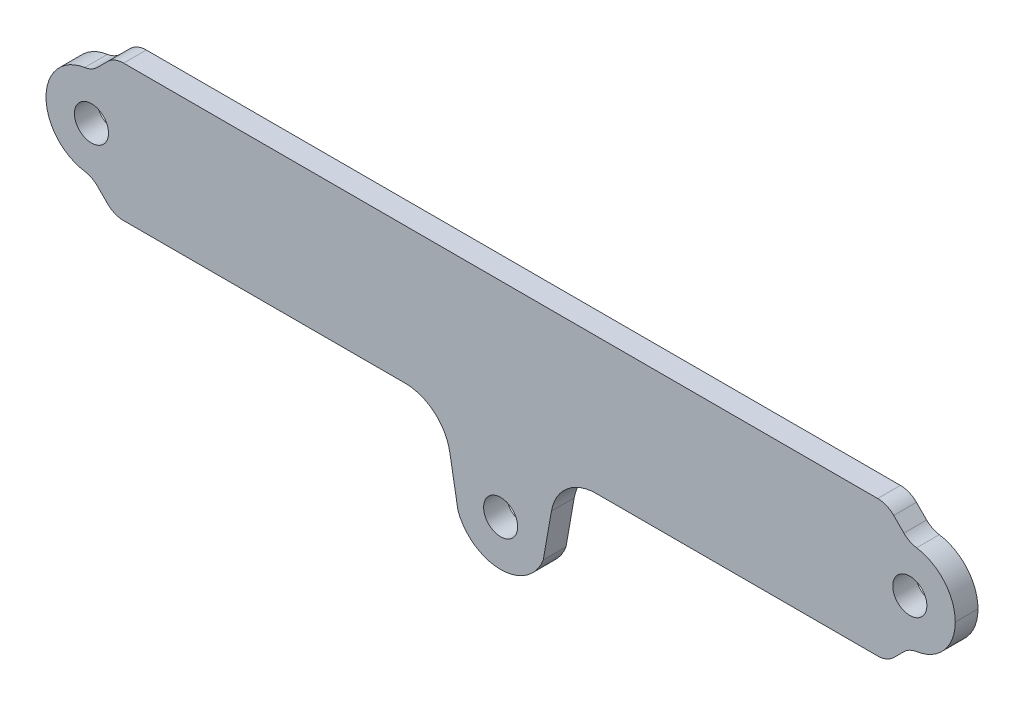
ISO-10303-21;
HEADER;
FILE_DESCRIPTION(('STEP AP214'),'2;1');
FILE_NAME('part.step','',(''),(''),'','','');
FILE_SCHEMA(('AUTOMOTIVE_DESIGN { 1 0 10303 214 1 1 1 1 }'));
ENDSEC;
DATA;
#1=APPLICATION_CONTEXT('core data for automotive mechanical design processes');
#2=APPLICATION_PROTOCOL_DEFINITION('international standard','automotive_design',2000,#1);
#3=PRODUCT_CONTEXT('',#1,'mechanical');
#4=PRODUCT('Part','Part','',(#3));
#5=PRODUCT_RELATED_PRODUCT_CATEGORY('part','',(#4));
#6=PRODUCT_DEFINITION_FORMATION('','',#4);
#7=PRODUCT_DEFINITION_CONTEXT('part definition',#1,'design');
#8=PRODUCT_DEFINITION('design','',#6,#7);
#9=PRODUCT_DEFINITION_SHAPE('','',#8);
#10=(LENGTH_UNIT() NAMED_UNIT(*) SI_UNIT(.MILLI.,.METRE.));
#11=(NAMED_UNIT(*) PLANE_ANGLE_UNIT() SI_UNIT($,.RADIAN.));
#12=(NAMED_UNIT(*) SI_UNIT($,.STERADIAN.) SOLID_ANGLE_UNIT());
#13=UNCERTAINTY_MEASURE_WITH_UNIT(LENGTH_MEASURE(1.E-05),#10,'distance_accuracy_value','');
#14=(GEOMETRIC_REPRESENTATION_CONTEXT(3) GLOBAL_UNCERTAINTY_ASSIGNED_CONTEXT((#13)) GLOBAL_UNIT_ASSIGNED_CONTEXT((#10,
#11,#12)) REPRESENTATION_CONTEXT('',''));
#15=CARTESIAN_POINT('',(0.,0.,0.));
#16=DIRECTION('',(0.,0.,1.));
#17=DIRECTION('',(1.,0.,0.));
#18=AXIS2_PLACEMENT_3D('',#15,#16,#17);
#19=CARTESIAN_POINT('',(50.8,-10.16,2.54));
#20=DIRECTION('',(0.,0.,1.));
#21=DIRECTION('',(1.,0.,0.));
#22=AXIS2_PLACEMENT_3D('',#19,#20,#21);
#23=PLANE('',#22);
#24=CARTESIAN_POINT('',(50.8,-10.16,2.54));
#25=DIRECTION('',(0.,0.,-1.));
#26=DIRECTION('',(1.,0.,0.));
#27=AXIS2_PLACEMENT_3D('',#24,#25,#26);
#28=CIRCLE('',#27,1.905);
#29=CARTESIAN_POINT('',(52.705,-10.16,2.54));
#30=VERTEX_POINT('',#29);
#31=EDGE_CURVE('E213',#30,#30,#28,.T.);
#32=ORIENTED_EDGE('',*,*,#31,.T.);
#33=EDGE_LOOP('',(#32));
#34=FACE_BOUND('',#33,.T.);
#35=DIRECTION('',(0.707106781186547,-0.707106781186549,0.));
#36=VECTOR('',#35,1.);
#37=CARTESIAN_POINT('',(5.08,0.,2.54));
#38=LINE('',#37,#36);
#39=CARTESIAN_POINT('',(5.73857152194441,-0.658571521944407,2.54));
#40=VERTEX_POINT('',#39);
#41=CARTESIAN_POINT('',(6.87605122421382,-1.79605122421383,2.54));
#42=VERTEX_POINT('',#41);
#43=EDGE_CURVE('E356',#40,#42,#38,.T.);
#44=ORIENTED_EDGE('',*,*,#43,.T.);
#45=CARTESIAN_POINT('',(8.67210244842766,0.,2.54));
#46=DIRECTION('',(0.,0.,1.));
#47=DIRECTION('',(1.,0.,0.));
#48=AXIS2_PLACEMENT_3D('',#45,#46,#47);
#49=CIRCLE('',#48,2.54);
#50=CARTESIAN_POINT('',(8.67210244842766,-2.54,2.54));
#51=VERTEX_POINT('',#50);
#52=EDGE_CURVE('E449',#42,#51,#49,.T.);
#53=ORIENTED_EDGE('',*,*,#52,.T.);
#54=DIRECTION('',(1.,0.,0.));
#55=VECTOR('',#54,1.);
#56=CARTESIAN_POINT('',(7.61999999999999,-2.54,2.54));
#57=LINE('',#56,#55);
#58=CARTESIAN_POINT('',(40.1184513436175,-2.54,2.54));
#59=VERTEX_POINT('',#58);
#60=EDGE_CURVE('E359',#51,#59,#57,.T.);
#61=ORIENTED_EDGE('',*,*,#60,.T.);
#62=CARTESIAN_POINT('',(40.1184513436175,-7.62,2.54));
#63=DIRECTION('',(0.,0.,1.));
#64=DIRECTION('',(1.,0.,0.));
#65=AXIS2_PLACEMENT_3D('',#62,#63,#64);
#66=CIRCLE('',#65,5.08);
#67=CARTESIAN_POINT('',(45.1212747289195,-6.73786725745201,2.54));
#68=VERTEX_POINT('',#67);
#69=EDGE_CURVE('E424',#59,#68,#66,.F.);
#70=ORIENTED_EDGE('',*,*,#69,.T.);
#71=DIRECTION('',(0.173648177666927,-0.984807753012209,0.));
#72=VECTOR('',#71,1.);
#73=CARTESIAN_POINT('',(44.3810774699981,-2.54,2.54));
#74=LINE('',#73,#72);
#75=CARTESIAN_POINT('',(46.0353892146103,-11.9220681211998,2.54));
#76=VERTEX_POINT('',#75);
#77=EDGE_CURVE('E208',#68,#76,#74,.T.);
#78=ORIENTED_EDGE('',*,*,#77,.T.);
#79=CARTESIAN_POINT('',(50.8,-10.16,2.54));
#80=DIRECTION('',(0.,0.,1.));
#81=DIRECTION('',(1.,0.,0.));
#82=AXIS2_PLACEMENT_3D('',#79,#80,#81);
#83=CIRCLE('',#82,5.08000000000001);
#84=CARTESIAN_POINT('',(55.5646107853897,-11.9220681211998,2.54));
#85=VERTEX_POINT('',#84);
#86=EDGE_CURVE('E200',#76,#85,#83,.T.);
#87=ORIENTED_EDGE('',*,*,#86,.T.);
#88=DIRECTION('',(-0.173648177666926,-0.984807753012209,0.));
#89=VECTOR('',#88,1.);
#90=CARTESIAN_POINT('',(57.2189225300019,-2.53999999999999,2.54));
#91=LINE('',#90,#89);
#92=CARTESIAN_POINT('',(56.4787252710805,-6.737867257452,2.54));
#93=VERTEX_POINT('',#92);
#94=EDGE_CURVE('E206',#93,#85,#91,.T.);
#95=ORIENTED_EDGE('',*,*,#94,.F.);
#96=CARTESIAN_POINT('',(61.4815486563826,-7.61999999999999,2.54));
#97=DIRECTION('',(0.,0.,-1.));
#98=DIRECTION('',(-1.,0.,0.));
#99=AXIS2_PLACEMENT_3D('',#96,#97,#98);
#100=CIRCLE('',#99,5.08);
#101=CARTESIAN_POINT('',(61.4815486563825,-2.53999999999999,2.54));
#102=VERTEX_POINT('',#101);
#103=EDGE_CURVE('E282',#102,#93,#100,.F.);
#104=ORIENTED_EDGE('',*,*,#103,.F.);
#105=DIRECTION('',(-1.,0.,0.));
#106=VECTOR('',#105,1.);
#107=CARTESIAN_POINT('',(93.98,-2.53999999999996,2.54));
#108=LINE('',#107,#106);
#109=CARTESIAN_POINT('',(92.9278975515724,-2.53999999999996,2.54));
#110=VERTEX_POINT('',#109);
#111=EDGE_CURVE('E230',#110,#102,#108,.T.);
#112=ORIENTED_EDGE('',*,*,#111,.F.);
#113=CARTESIAN_POINT('',(92.9278975515724,0.,2.54));
#114=DIRECTION('',(0.,0.,-1.));
#115=DIRECTION('',(-1.,0.,0.));
#116=AXIS2_PLACEMENT_3D('',#113,#114,#115);
#117=CIRCLE('',#116,2.54);
#118=CARTESIAN_POINT('',(94.7239487757862,-1.79605122421379,2.54));
#119=VERTEX_POINT('',#118);
#120=EDGE_CURVE('E310',#119,#110,#117,.T.);
#121=ORIENTED_EDGE('',*,*,#120,.F.);
#122=DIRECTION('',(-0.707106781186546,-0.707106781186549,0.));
#123=VECTOR('',#122,1.);
#124=CARTESIAN_POINT('',(96.52,0.,2.54));
#125=LINE('',#124,#123);
#126=CARTESIAN_POINT('',(95.8614284780556,-0.658571521944366,2.54));
#127=VERTEX_POINT('',#126);
#128=EDGE_CURVE('E237',#127,#119,#125,.T.);
#129=ORIENTED_EDGE('',*,*,#128,.F.);
#130=CARTESIAN_POINT('',(97.6574797022694,-2.45462274615819,2.54));
#131=DIRECTION('',(0.,0.,-1.));
#132=DIRECTION('',(-1.,0.,0.));
#133=AXIS2_PLACEMENT_3D('',#130,#131,#132);
#134=CIRCLE('',#133,2.54);
#135=CARTESIAN_POINT('',(97.2783198015129,0.0569181692278863,2.54));
#136=VERTEX_POINT('',#135);
#137=EDGE_CURVE('E334',#136,#127,#134,.F.);
#138=ORIENTED_EDGE('',*,*,#137,.F.);
#139=CARTESIAN_POINT('',(96.52,5.08000000000004,2.54));
#140=DIRECTION('',(0.,0.,-1.));
#141=DIRECTION('',(-1.,0.,0.));
#142=AXIS2_PLACEMENT_3D('',#139,#140,#141);
#143=CIRCLE('',#142,5.08);
#144=CARTESIAN_POINT('',(101.6,5.08000000000005,2.54));
#145=VERTEX_POINT('',#144);
#146=EDGE_CURVE('E274',#145,#136,#143,.T.);
#147=ORIENTED_EDGE('',*,*,#146,.F.);
#148=CARTESIAN_POINT('',(96.52,5.08000000000004,2.54));
#149=DIRECTION('',(0.,0.,-1.));
#150=DIRECTION('',(-1.,0.,0.));
#151=AXIS2_PLACEMENT_3D('',#148,#149,#150);
#152=CIRCLE('',#151,5.08);
#153=CARTESIAN_POINT('',(97.2783198015129,10.1030818307722,2.54));
#154=VERTEX_POINT('',#153);
#155=EDGE_CURVE('E270',#154,#145,#152,.T.);
#156=ORIENTED_EDGE('',*,*,#155,.F.);
#157=CARTESIAN_POINT('',(97.6574797022694,12.6146227461583,2.54));
#158=DIRECTION('',(0.,0.,-1.));
#159=DIRECTION('',(-1.,0.,0.));
#160=AXIS2_PLACEMENT_3D('',#157,#158,#159);
#161=CIRCLE('',#160,2.54);
#162=CARTESIAN_POINT('',(95.8614284780556,10.8185715219444,2.54));
#163=VERTEX_POINT('',#162);
#164=EDGE_CURVE('E342',#163,#154,#161,.F.);
#165=ORIENTED_EDGE('',*,*,#164,.F.);
#166=DIRECTION('',(0.707106781186547,-0.707106781186548,0.));
#167=VECTOR('',#166,1.);
#168=CARTESIAN_POINT('',(96.52,10.16,2.54));
#169=LINE('',#168,#167);
#170=CARTESIAN_POINT('',(94.7239487757862,11.9560512242139,2.54));
#171=VERTEX_POINT('',#170);
#172=EDGE_CURVE('E225',#171,#163,#169,.T.);
#173=ORIENTED_EDGE('',*,*,#172,.F.);
#174=CARTESIAN_POINT('',(92.9278975515724,10.16,2.54));
#175=DIRECTION('',(0.,0.,-1.));
#176=DIRECTION('',(-1.,0.,0.));
#177=AXIS2_PLACEMENT_3D('',#174,#175,#176);
#178=CIRCLE('',#177,2.54);
#179=CARTESIAN_POINT('',(92.9278975515723,12.7,2.54));
#180=VERTEX_POINT('',#179);
#181=EDGE_CURVE('E306',#180,#171,#178,.T.);
#182=ORIENTED_EDGE('',*,*,#181,.F.);
#183=DIRECTION('',(-1.,0.,0.));
#184=VECTOR('',#183,1.);
#185=CARTESIAN_POINT('',(7.61999999999999,12.7,2.54));
#186=LINE('',#185,#184);
#187=CARTESIAN_POINT('',(8.67210244842765,12.7,2.54));
#188=VERTEX_POINT('',#187);
#189=EDGE_CURVE('E368',#180,#188,#186,.T.);
#190=ORIENTED_EDGE('',*,*,#189,.T.);
#191=CARTESIAN_POINT('',(8.67210244842765,10.16,2.54));
#192=DIRECTION('',(0.,0.,1.));
#193=DIRECTION('',(1.,0.,0.));
#194=AXIS2_PLACEMENT_3D('',#191,#192,#193);
#195=CIRCLE('',#194,2.54);
#196=CARTESIAN_POINT('',(6.87605122421382,11.9560512242138,2.54));
#197=VERTEX_POINT('',#196);
#198=EDGE_CURVE('E61',#188,#197,#195,.T.);
#199=ORIENTED_EDGE('',*,*,#198,.T.);
#200=DIRECTION('',(-0.707106781186546,-0.707106781186549,0.));
#201=VECTOR('',#200,1.);
#202=CARTESIAN_POINT('',(5.08,10.16,2.54));
#203=LINE('',#202,#201);
#204=CARTESIAN_POINT('',(5.7385715219444,10.8185715219444,2.54));
#205=VERTEX_POINT('',#204);
#206=EDGE_CURVE('E371',#197,#205,#203,.T.);
#207=ORIENTED_EDGE('',*,*,#206,.T.);
#208=CARTESIAN_POINT('',(3.94252029773057,12.6146227461582,2.54));
#209=DIRECTION('',(0.,0.,1.));
#210=DIRECTION('',(1.,0.,0.));
#211=AXIS2_PLACEMENT_3D('',#208,#209,#210);
#212=CIRCLE('',#211,2.54);
#213=CARTESIAN_POINT('',(4.32168019848705,10.1030818307722,2.54));
#214=VERTEX_POINT('',#213);
#215=EDGE_CURVE('E11',#205,#214,#212,.F.);
#216=ORIENTED_EDGE('',*,*,#215,.T.);
#217=CARTESIAN_POINT('',(5.08,5.08,2.54));
#218=DIRECTION('',(0.,0.,1.));
#219=DIRECTION('',(1.,0.,0.));
#220=AXIS2_PLACEMENT_3D('',#217,#218,#219);
#221=CIRCLE('',#220,5.08);
#222=CARTESIAN_POINT('',(0.,5.08,2.54));
#223=VERTEX_POINT('',#222);
#224=EDGE_CURVE('E413',#214,#223,#221,.T.);
#225=ORIENTED_EDGE('',*,*,#224,.T.);
#226=CARTESIAN_POINT('',(5.08,5.08,2.54));
#227=DIRECTION('',(0.,0.,1.));
#228=DIRECTION('',(1.,0.,0.));
#229=AXIS2_PLACEMENT_3D('',#226,#227,#228);
#230=CIRCLE('',#229,5.08);
#231=CARTESIAN_POINT('',(4.32168019848705,0.056918169227844,2.54));
#232=VERTEX_POINT('',#231);
#233=EDGE_CURVE('E416',#223,#232,#230,.T.);
#234=ORIENTED_EDGE('',*,*,#233,.T.);
#235=CARTESIAN_POINT('',(3.94252029773057,-2.45462274615823,2.54));
#236=DIRECTION('',(0.,0.,1.));
#237=DIRECTION('',(1.,0.,0.));
#238=AXIS2_PLACEMENT_3D('',#235,#236,#237);
#239=CIRCLE('',#238,2.54);
#240=EDGE_CURVE('E471',#232,#40,#239,.F.);
#241=ORIENTED_EDGE('',*,*,#240,.T.);
#242=EDGE_LOOP('',(#44,#53,#61,#70,#78,#87,#95,#104,#112,#121,#129,#138,#147,#156,#165,#173,
#182,#190,#199,#207,#216,#225,#234,#241));
#243=FACE_BOUND('',#242,.T.);
#244=CARTESIAN_POINT('',(5.08,5.08,2.54));
#245=DIRECTION('',(0.,0.,1.));
#246=DIRECTION('',(1.,0.,0.));
#247=AXIS2_PLACEMENT_3D('',#244,#245,#246);
#248=CIRCLE('',#247,1.905);
#249=CARTESIAN_POINT('',(6.985,5.08,2.54));
#250=VERTEX_POINT('',#249);
#251=EDGE_CURVE('E347',#250,#250,#248,.T.);
#252=ORIENTED_EDGE('',*,*,#251,.F.);
#253=EDGE_LOOP('',(#252));
#254=FACE_BOUND('',#253,.T.);
#255=CARTESIAN_POINT('',(96.52,5.08000000000004,2.54));
#256=DIRECTION('',(0.,0.,-1.));
#257=DIRECTION('',(-1.,0.,0.));
#258=AXIS2_PLACEMENT_3D('',#255,#256,#257);
#259=CIRCLE('',#258,1.905);
#260=CARTESIAN_POINT('',(94.615,5.08000000000004,2.54));
#261=VERTEX_POINT('',#260);
#262=EDGE_CURVE('E246',#261,#261,#259,.T.);
#263=ORIENTED_EDGE('',*,*,#262,.T.);
#264=EDGE_LOOP('',(#263));
#265=FACE_BOUND('',#264,.T.);
#266=ADVANCED_FACE('F38',(#34,#243,#254,#265),#23,.T.);
#267=CARTESIAN_POINT('',(50.8,-10.16,0.));
#268=DIRECTION('',(0.,0.,1.));
#269=DIRECTION('',(1.,0.,0.));
#270=AXIS2_PLACEMENT_3D('',#267,#268,#269);
#271=PLANE('',#270);
#272=CARTESIAN_POINT('',(50.8,-10.16,0.));
#273=DIRECTION('',(0.,0.,-1.));
#274=DIRECTION('',(1.,0.,0.));
#275=AXIS2_PLACEMENT_3D('',#272,#273,#274);
#276=CIRCLE('',#275,1.905);
#277=CARTESIAN_POINT('',(52.705,-10.16,0.));
#278=VERTEX_POINT('',#277);
#279=EDGE_CURVE('E386',#278,#278,#276,.T.);
#280=ORIENTED_EDGE('',*,*,#279,.F.);
#281=EDGE_LOOP('',(#280));
#282=FACE_BOUND('',#281,.T.);
#283=DIRECTION('',(1.,0.,0.));
#284=VECTOR('',#283,1.);
#285=CARTESIAN_POINT('',(7.61999999999999,-2.54,0.));
#286=LINE('',#285,#284);
#287=CARTESIAN_POINT('',(8.67210244842766,-2.54,0.));
#288=VERTEX_POINT('',#287);
#289=CARTESIAN_POINT('',(40.1184513436175,-2.54,0.));
#290=VERTEX_POINT('',#289);
#291=EDGE_CURVE('E378',#288,#290,#286,.T.);
#292=ORIENTED_EDGE('',*,*,#291,.F.);
#293=CARTESIAN_POINT('',(8.67210244842766,0.,0.));
#294=DIRECTION('',(0.,0.,1.));
#295=DIRECTION('',(1.,0.,0.));
#296=AXIS2_PLACEMENT_3D('',#293,#294,#295);
#297=CIRCLE('',#296,2.54);
#298=CARTESIAN_POINT('',(6.87605122421382,-1.79605122421383,0.));
#299=VERTEX_POINT('',#298);
#300=EDGE_CURVE('E437',#288,#299,#297,.F.);
#301=ORIENTED_EDGE('',*,*,#300,.T.);
#302=DIRECTION('',(0.707106781186547,-0.707106781186549,0.));
#303=VECTOR('',#302,1.);
#304=CARTESIAN_POINT('',(5.08,0.,0.));
#305=LINE('',#304,#303);
#306=CARTESIAN_POINT('',(5.73857152194441,-0.658571521944407,0.));
#307=VERTEX_POINT('',#306);
#308=EDGE_CURVE('E351',#307,#299,#305,.T.);
#309=ORIENTED_EDGE('',*,*,#308,.F.);
#310=CARTESIAN_POINT('',(3.94252029773057,-2.45462274615823,0.));
#311=DIRECTION('',(0.,0.,1.));
#312=DIRECTION('',(1.,0.,0.));
#313=AXIS2_PLACEMENT_3D('',#310,#311,#312);
#314=CIRCLE('',#313,2.54);
#315=CARTESIAN_POINT('',(4.32168019848705,0.056918169227844,0.));
#316=VERTEX_POINT('',#315);
#317=EDGE_CURVE('E468',#307,#316,#314,.T.);
#318=ORIENTED_EDGE('',*,*,#317,.T.);
#319=CARTESIAN_POINT('',(5.08,5.08,0.));
#320=DIRECTION('',(0.,0.,1.));
#321=DIRECTION('',(1.,0.,0.));
#322=AXIS2_PLACEMENT_3D('',#319,#320,#321);
#323=CIRCLE('',#322,5.08);
#324=CARTESIAN_POINT('',(0.,5.08,0.));
#325=VERTEX_POINT('',#324);
#326=EDGE_CURVE('E410',#316,#325,#323,.F.);
#327=ORIENTED_EDGE('',*,*,#326,.T.);
#328=CARTESIAN_POINT('',(5.08,5.08,0.));
#329=DIRECTION('',(0.,0.,1.));
#330=DIRECTION('',(1.,0.,0.));
#331=AXIS2_PLACEMENT_3D('',#328,#329,#330);
#332=CIRCLE('',#331,5.08);
#333=CARTESIAN_POINT('',(4.32168019848705,10.1030818307722,0.));
#334=VERTEX_POINT('',#333);
#335=EDGE_CURVE('E406',#325,#334,#332,.F.);
#336=ORIENTED_EDGE('',*,*,#335,.T.);
#337=CARTESIAN_POINT('',(3.94252029773057,12.6146227461582,0.));
#338=DIRECTION('',(0.,0.,1.));
#339=DIRECTION('',(1.,0.,0.));
#340=AXIS2_PLACEMENT_3D('',#337,#338,#339);
#341=CIRCLE('',#340,2.54);
#342=CARTESIAN_POINT('',(5.7385715219444,10.8185715219444,0.));
#343=VERTEX_POINT('',#342);
#344=EDGE_CURVE('E47',#334,#343,#341,.T.);
#345=ORIENTED_EDGE('',*,*,#344,.T.);
#346=DIRECTION('',(-0.707106781186546,-0.707106781186549,0.));
#347=VECTOR('',#346,1.);
#348=CARTESIAN_POINT('',(5.08,10.16,0.));
#349=LINE('',#348,#347);
#350=CARTESIAN_POINT('',(6.87605122421382,11.9560512242138,0.));
#351=VERTEX_POINT('',#350);
#352=EDGE_CURVE('E360',#351,#343,#349,.T.);
#353=ORIENTED_EDGE('',*,*,#352,.F.);
#354=CARTESIAN_POINT('',(8.67210244842765,10.16,0.));
#355=DIRECTION('',(0.,0.,1.));
#356=DIRECTION('',(1.,0.,0.));
#357=AXIS2_PLACEMENT_3D('',#354,#355,#356);
#358=CIRCLE('',#357,2.54);
#359=CARTESIAN_POINT('',(8.67210244842765,12.7,0.));
#360=VERTEX_POINT('',#359);
#361=EDGE_CURVE('E434',#351,#360,#358,.F.);
#362=ORIENTED_EDGE('',*,*,#361,.T.);
#363=DIRECTION('',(-1.,0.,0.));
#364=VECTOR('',#363,1.);
#365=CARTESIAN_POINT('',(7.61999999999999,12.7,0.));
#366=LINE('',#365,#364);
#367=CARTESIAN_POINT('',(92.9278975515723,12.7,0.));
#368=VERTEX_POINT('',#367);
#369=EDGE_CURVE('E390',#368,#360,#366,.T.);
#370=ORIENTED_EDGE('',*,*,#369,.F.);
#371=CARTESIAN_POINT('',(92.9278975515724,10.16,0.));
#372=DIRECTION('',(0.,0.,-1.));
#373=DIRECTION('',(-1.,0.,0.));
#374=AXIS2_PLACEMENT_3D('',#371,#372,#373);
#375=CIRCLE('',#374,2.54);
#376=CARTESIAN_POINT('',(94.7239487757862,11.9560512242139,0.));
#377=VERTEX_POINT('',#376);
#378=EDGE_CURVE('E292',#377,#368,#375,.F.);
#379=ORIENTED_EDGE('',*,*,#378,.F.);
#380=DIRECTION('',(0.707106781186547,-0.707106781186548,0.));
#381=VECTOR('',#380,1.);
#382=CARTESIAN_POINT('',(96.52,10.16,0.));
#383=LINE('',#382,#381);
#384=CARTESIAN_POINT('',(95.8614284780556,10.8185715219444,0.));
#385=VERTEX_POINT('',#384);
#386=EDGE_CURVE('E253',#377,#385,#383,.T.);
#387=ORIENTED_EDGE('',*,*,#386,.T.);
#388=CARTESIAN_POINT('',(97.6574797022694,12.6146227461583,0.));
#389=DIRECTION('',(0.,0.,-1.));
#390=DIRECTION('',(-1.,0.,0.));
#391=AXIS2_PLACEMENT_3D('',#388,#389,#390);
#392=CIRCLE('',#391,2.54);
#393=CARTESIAN_POINT('',(97.2783198015129,10.1030818307722,0.));
#394=VERTEX_POINT('',#393);
#395=EDGE_CURVE('E338',#394,#385,#392,.T.);
#396=ORIENTED_EDGE('',*,*,#395,.F.);
#397=CARTESIAN_POINT('',(96.52,5.08000000000004,0.));
#398=DIRECTION('',(0.,0.,-1.));
#399=DIRECTION('',(-1.,0.,0.));
#400=AXIS2_PLACEMENT_3D('',#397,#398,#399);
#401=CIRCLE('',#400,5.08);
#402=CARTESIAN_POINT('',(101.6,5.08000000000005,0.));
#403=VERTEX_POINT('',#402);
#404=EDGE_CURVE('E262',#403,#394,#401,.F.);
#405=ORIENTED_EDGE('',*,*,#404,.F.);
#406=CARTESIAN_POINT('',(96.52,5.08000000000004,0.));
#407=DIRECTION('',(0.,0.,-1.));
#408=DIRECTION('',(-1.,0.,0.));
#409=AXIS2_PLACEMENT_3D('',#406,#407,#408);
#410=CIRCLE('',#409,5.08);
#411=CARTESIAN_POINT('',(97.2783198015129,0.0569181692278863,0.));
#412=VERTEX_POINT('',#411);
#413=EDGE_CURVE('E266',#412,#403,#410,.F.);
#414=ORIENTED_EDGE('',*,*,#413,.F.);
#415=CARTESIAN_POINT('',(97.6574797022694,-2.45462274615819,0.));
#416=DIRECTION('',(0.,0.,-1.));
#417=DIRECTION('',(-1.,0.,0.));
#418=AXIS2_PLACEMENT_3D('',#415,#416,#417);
#419=CIRCLE('',#418,2.54);
#420=CARTESIAN_POINT('',(95.8614284780556,-0.658571521944366,0.));
#421=VERTEX_POINT('',#420);
#422=EDGE_CURVE('E330',#421,#412,#419,.T.);
#423=ORIENTED_EDGE('',*,*,#422,.F.);
#424=DIRECTION('',(-0.707106781186546,-0.707106781186549,0.));
#425=VECTOR('',#424,1.);
#426=CARTESIAN_POINT('',(96.52,0.,0.));
#427=LINE('',#426,#425);
#428=CARTESIAN_POINT('',(94.7239487757862,-1.79605122421379,0.));
#429=VERTEX_POINT('',#428);
#430=EDGE_CURVE('E241',#421,#429,#427,.T.);
#431=ORIENTED_EDGE('',*,*,#430,.T.);
#432=CARTESIAN_POINT('',(92.9278975515724,0.,0.));
#433=DIRECTION('',(0.,0.,-1.));
#434=DIRECTION('',(-1.,0.,0.));
#435=AXIS2_PLACEMENT_3D('',#432,#433,#434);
#436=CIRCLE('',#435,2.54);
#437=CARTESIAN_POINT('',(92.9278975515724,-2.53999999999996,0.));
#438=VERTEX_POINT('',#437);
#439=EDGE_CURVE('E296',#438,#429,#436,.F.);
#440=ORIENTED_EDGE('',*,*,#439,.F.);
#441=DIRECTION('',(-1.,0.,0.));
#442=VECTOR('',#441,1.);
#443=CARTESIAN_POINT('',(93.98,-2.53999999999996,0.));
#444=LINE('',#443,#442);
#445=CARTESIAN_POINT('',(61.4815486563825,-2.53999999999999,0.));
#446=VERTEX_POINT('',#445);
#447=EDGE_CURVE('E245',#438,#446,#444,.T.);
#448=ORIENTED_EDGE('',*,*,#447,.T.);
#449=CARTESIAN_POINT('',(61.4815486563826,-7.61999999999999,0.));
#450=DIRECTION('',(0.,0.,-1.));
#451=DIRECTION('',(-1.,0.,0.));
#452=AXIS2_PLACEMENT_3D('',#449,#450,#451);
#453=CIRCLE('',#452,5.08);
#454=CARTESIAN_POINT('',(56.4787252710805,-6.737867257452,0.));
#455=VERTEX_POINT('',#454);
#456=EDGE_CURVE('E278',#455,#446,#453,.T.);
#457=ORIENTED_EDGE('',*,*,#456,.F.);
#458=DIRECTION('',(-0.173648177666926,-0.984807753012209,0.));
#459=VECTOR('',#458,1.);
#460=CARTESIAN_POINT('',(57.2189225300019,-2.53999999999999,0.));
#461=LINE('',#460,#459);
#462=CARTESIAN_POINT('',(55.5646107853897,-11.9220681211998,0.));
#463=VERTEX_POINT('',#462);
#464=EDGE_CURVE('E250',#455,#463,#461,.T.);
#465=ORIENTED_EDGE('',*,*,#464,.T.);
#466=CARTESIAN_POINT('',(50.8,-10.16,0.));
#467=DIRECTION('',(0.,0.,1.));
#468=DIRECTION('',(1.,0.,0.));
#469=AXIS2_PLACEMENT_3D('',#466,#467,#468);
#470=CIRCLE('',#469,5.08000000000001);
#471=CARTESIAN_POINT('',(46.0353892146103,-11.9220681211998,0.));
#472=VERTEX_POINT('',#471);
#473=EDGE_CURVE('E219',#472,#463,#470,.T.);
#474=ORIENTED_EDGE('',*,*,#473,.F.);
#475=DIRECTION('',(0.173648177666927,-0.984807753012209,0.));
#476=VECTOR('',#475,1.);
#477=CARTESIAN_POINT('',(44.3810774699981,-2.54,0.));
#478=LINE('',#477,#476);
#479=CARTESIAN_POINT('',(45.1212747289195,-6.73786725745201,0.));
#480=VERTEX_POINT('',#479);
#481=EDGE_CURVE('E381',#480,#472,#478,.T.);
#482=ORIENTED_EDGE('',*,*,#481,.F.);
#483=CARTESIAN_POINT('',(40.1184513436175,-7.62,0.));
#484=DIRECTION('',(0.,0.,1.));
#485=DIRECTION('',(1.,0.,0.));
#486=AXIS2_PLACEMENT_3D('',#483,#484,#485);
#487=CIRCLE('',#486,5.08);
#488=EDGE_CURVE('E420',#480,#290,#487,.T.);
#489=ORIENTED_EDGE('',*,*,#488,.T.);
#490=EDGE_LOOP('',(#292,#301,#309,#318,#327,#336,#345,#353,#362,#370,#379,#387,#396,#405,#414,
#423,#431,#440,#448,#457,#465,#474,#482,#489));
#491=FACE_BOUND('',#490,.T.);
#492=CARTESIAN_POINT('',(5.08,5.08,0.));
#493=DIRECTION('',(0.,0.,1.));
#494=DIRECTION('',(1.,0.,0.));
#495=AXIS2_PLACEMENT_3D('',#492,#493,#494);
#496=CIRCLE('',#495,1.905);
#497=CARTESIAN_POINT('',(6.985,5.08,0.));
#498=VERTEX_POINT('',#497);
#499=EDGE_CURVE('E352',#498,#498,#496,.T.);
#500=ORIENTED_EDGE('',*,*,#499,.T.);
#501=EDGE_LOOP('',(#500));
#502=FACE_BOUND('',#501,.T.);
#503=CARTESIAN_POINT('',(96.52,5.08000000000004,0.));
#504=DIRECTION('',(0.,0.,-1.));
#505=DIRECTION('',(-1.,0.,0.));
#506=AXIS2_PLACEMENT_3D('',#503,#504,#505);
#507=CIRCLE('',#506,1.905);
#508=CARTESIAN_POINT('',(94.615,5.08000000000004,0.));
#509=VERTEX_POINT('',#508);
#510=EDGE_CURVE('E289',#509,#509,#507,.T.);
#511=ORIENTED_EDGE('',*,*,#510,.F.);
#512=EDGE_LOOP('',(#511));
#513=FACE_BOUND('',#512,.T.);
#514=ADVANCED_FACE('F477',(#282,#491,#502,#513),#271,.F.);
#515=CARTESIAN_POINT('',(5.08,0.,2.54));
#516=DIRECTION('',(0.707106781186548,0.707106781186547,0.));
#517=DIRECTION('',(-0.707106781186547,0.707106781186548,0.));
#518=AXIS2_PLACEMENT_3D('',#515,#516,#517);
#519=PLANE('',#518);
#520=ORIENTED_EDGE('',*,*,#308,.T.);
#521=DIRECTION('',(0.,0.,-1.));
#522=VECTOR('',#521,1.);
#523=CARTESIAN_POINT('',(6.87605122421382,-1.79605122421383,2.54));
#524=LINE('',#523,#522);
#525=EDGE_CURVE('E444',#299,#42,#524,.F.);
#526=ORIENTED_EDGE('',*,*,#525,.T.);
#527=ORIENTED_EDGE('',*,*,#43,.F.);
#528=DIRECTION('',(0.,0.,-1.));
#529=VECTOR('',#528,1.);
#530=CARTESIAN_POINT('',(5.73857152194441,-0.658571521944407,2.54));
#531=LINE('',#530,#529);
#532=EDGE_CURVE('E440',#40,#307,#531,.T.);
#533=ORIENTED_EDGE('',*,*,#532,.T.);
#534=EDGE_LOOP('',(#520,#526,#527,#533));
#535=FACE_BOUND('',#534,.T.);
#536=ADVANCED_FACE('F502',(#535),#519,.F.);
#537=CARTESIAN_POINT('',(7.61999999999999,-2.54,2.54));
#538=DIRECTION('',(0.,1.,0.));
#539=DIRECTION('',(0.,0.,1.));
#540=AXIS2_PLACEMENT_3D('',#537,#538,#539);
#541=PLANE('',#540);
#542=ORIENTED_EDGE('',*,*,#60,.F.);
#543=DIRECTION('',(0.,0.,-1.));
#544=VECTOR('',#543,1.);
#545=CARTESIAN_POINT('',(8.67210244842766,-2.54,2.54));
#546=LINE('',#545,#544);
#547=EDGE_CURVE('E427',#51,#288,#546,.T.);
#548=ORIENTED_EDGE('',*,*,#547,.T.);
#549=ORIENTED_EDGE('',*,*,#291,.T.);
#550=DIRECTION('',(0.,0.,-1.));
#551=VECTOR('',#550,1.);
#552=CARTESIAN_POINT('',(40.1184513436175,-2.54,2.54));
#553=LINE('',#552,#551);
#554=EDGE_CURVE('E402',#290,#59,#553,.F.);
#555=ORIENTED_EDGE('',*,*,#554,.T.);
#556=EDGE_LOOP('',(#542,#548,#549,#555));
#557=FACE_BOUND('',#556,.T.);
#558=ADVANCED_FACE('F510',(#557),#541,.F.);
#559=CARTESIAN_POINT('',(44.3810774699981,-2.54,2.54));
#560=DIRECTION('',(0.984807753012209,0.173648177666927,0.));
#561=DIRECTION('',(-0.173648177666927,0.984807753012209,0.));
#562=AXIS2_PLACEMENT_3D('',#559,#560,#561);
#563=PLANE('',#562);
#564=ORIENTED_EDGE('',*,*,#77,.F.);
#565=DIRECTION('',(0.,0.,-1.));
#566=VECTOR('',#565,1.);
#567=CARTESIAN_POINT('',(45.1212747289195,-6.73786725745201,0.));
#568=LINE('',#567,#566);
#569=EDGE_CURVE('E398',#68,#480,#568,.T.);
#570=ORIENTED_EDGE('',*,*,#569,.T.);
#571=ORIENTED_EDGE('',*,*,#481,.T.);
#572=DIRECTION('',(0.,0.,-1.));
#573=VECTOR('',#572,1.);
#574=CARTESIAN_POINT('',(46.0353892146103,-11.9220681211998,2.54));
#575=LINE('',#574,#573);
#576=EDGE_CURVE('E374',#76,#472,#575,.T.);
#577=ORIENTED_EDGE('',*,*,#576,.F.);
#578=EDGE_LOOP('',(#564,#570,#571,#577));
#579=FACE_BOUND('',#578,.T.);
#580=ADVANCED_FACE('F516',(#579),#563,.F.);
#581=CARTESIAN_POINT('',(50.8,-10.16,2.54));
#582=DIRECTION('',(0.,0.,-1.));
#583=DIRECTION('',(-1.,0.,0.));
#584=AXIS2_PLACEMENT_3D('',#581,#582,#583);
#585=CYLINDRICAL_SURFACE('',#584,5.08000000000001);
#586=ORIENTED_EDGE('',*,*,#473,.T.);
#587=DIRECTION('',(0.,0.,-1.));
#588=VECTOR('',#587,1.);
#589=CARTESIAN_POINT('',(55.5646107853897,-11.9220681211998,2.54));
#590=LINE('',#589,#588);
#591=EDGE_CURVE('E216',#85,#463,#590,.T.);
#592=ORIENTED_EDGE('',*,*,#591,.F.);
#593=ORIENTED_EDGE('',*,*,#86,.F.);
#594=ORIENTED_EDGE('',*,*,#576,.T.);
#595=EDGE_LOOP('',(#586,#592,#593,#594));
#596=FACE_BOUND('',#595,.T.);
#597=ADVANCED_FACE('F217',(#596),#585,.T.);
#598=CARTESIAN_POINT('',(50.8,-10.16,2.54));
#599=DIRECTION('',(0.,0.,-1.));
#600=DIRECTION('',(-1.,0.,0.));
#601=AXIS2_PLACEMENT_3D('',#598,#599,#600);
#602=CYLINDRICAL_SURFACE('',#601,1.905);
#603=ORIENTED_EDGE('',*,*,#279,.T.);
#604=EDGE_LOOP('',(#603));
#605=FACE_BOUND('',#604,.T.);
#606=ORIENTED_EDGE('',*,*,#31,.F.);
#607=EDGE_LOOP('',(#606));
#608=FACE_BOUND('',#607,.T.);
#609=ADVANCED_FACE('F574',(#605,#608),#602,.F.);
#610=CARTESIAN_POINT('',(7.61999999999999,12.7,2.54));
#611=DIRECTION('',(0.,-1.,0.));
#612=DIRECTION('',(0.,0.,-1.));
#613=AXIS2_PLACEMENT_3D('',#610,#611,#612);
#614=PLANE('',#613);
#615=ORIENTED_EDGE('',*,*,#369,.T.);
#616=DIRECTION('',(0.,0.,-1.));
#617=VECTOR('',#616,1.);
#618=CARTESIAN_POINT('',(8.67210244842765,12.7,2.54));
#619=LINE('',#618,#617);
#620=EDGE_CURVE('E465',#360,#188,#619,.F.);
#621=ORIENTED_EDGE('',*,*,#620,.T.);
#622=ORIENTED_EDGE('',*,*,#189,.F.);
#623=DIRECTION('',(0.,0.,-1.));
#624=VECTOR('',#623,1.);
#625=CARTESIAN_POINT('',(92.9278975515723,12.7,2.54));
#626=LINE('',#625,#624);
#627=EDGE_CURVE('E326',#368,#180,#626,.F.);
#628=ORIENTED_EDGE('',*,*,#627,.F.);
#629=EDGE_LOOP('',(#615,#621,#622,#628));
#630=FACE_BOUND('',#629,.T.);
#631=ADVANCED_FACE('F571',(#630),#614,.F.);
#632=CARTESIAN_POINT('',(5.08,10.16,2.54));
#633=DIRECTION('',(0.707106781186549,-0.707106781186546,0.));
#634=DIRECTION('',(0.707106781186546,0.707106781186549,0.));
#635=AXIS2_PLACEMENT_3D('',#632,#633,#634);
#636=PLANE('',#635);
#637=ORIENTED_EDGE('',*,*,#352,.T.);
#638=DIRECTION('',(0.,0.,-1.));
#639=VECTOR('',#638,1.);
#640=CARTESIAN_POINT('',(5.7385715219444,10.8185715219444,2.54));
#641=LINE('',#640,#639);
#642=EDGE_CURVE('E54',#343,#205,#641,.F.);
#643=ORIENTED_EDGE('',*,*,#642,.T.);
#644=ORIENTED_EDGE('',*,*,#206,.F.);
#645=DIRECTION('',(0.,0.,-1.));
#646=VECTOR('',#645,1.);
#647=CARTESIAN_POINT('',(6.87605122421382,11.9560512242138,2.54));
#648=LINE('',#647,#646);
#649=EDGE_CURVE('E459',#197,#351,#648,.T.);
#650=ORIENTED_EDGE('',*,*,#649,.T.);
#651=EDGE_LOOP('',(#637,#643,#644,#650));
#652=FACE_BOUND('',#651,.T.);
#653=ADVANCED_FACE('F482',(#652),#636,.F.);
#654=CARTESIAN_POINT('',(5.08,5.08,2.54));
#655=DIRECTION('',(0.,0.,-1.));
#656=DIRECTION('',(-1.,0.,0.));
#657=AXIS2_PLACEMENT_3D('',#654,#655,#656);
#658=CYLINDRICAL_SURFACE('',#657,1.905);
#659=ORIENTED_EDGE('',*,*,#251,.T.);
#660=EDGE_LOOP('',(#659));
#661=FACE_BOUND('',#660,.T.);
#662=ORIENTED_EDGE('',*,*,#499,.F.);
#663=EDGE_LOOP('',(#662));
#664=FACE_BOUND('',#663,.T.);
#665=ADVANCED_FACE('F570',(#661,#664),#658,.F.);
#666=CARTESIAN_POINT('',(40.1184513436175,-7.62,2.54));
#667=DIRECTION('',(0.,0.,1.));
#668=DIRECTION('',(1.,0.,0.));
#669=AXIS2_PLACEMENT_3D('',#666,#667,#668);
#670=CYLINDRICAL_SURFACE('',#669,5.08);
#671=ORIENTED_EDGE('',*,*,#69,.F.);
#672=ORIENTED_EDGE('',*,*,#554,.F.);
#673=ORIENTED_EDGE('',*,*,#488,.F.);
#674=ORIENTED_EDGE('',*,*,#569,.F.);
#675=EDGE_LOOP('',(#671,#672,#673,#674));
#676=FACE_BOUND('',#675,.T.);
#677=ADVANCED_FACE('F518',(#676),#670,.F.);
#678=CARTESIAN_POINT('',(5.08,5.08,2.54));
#679=DIRECTION('',(0.,0.,-1.));
#680=DIRECTION('',(-1.,0.,0.));
#681=AXIS2_PLACEMENT_3D('',#678,#679,#680);
#682=CYLINDRICAL_SURFACE('',#681,5.08);
#683=ORIENTED_EDGE('',*,*,#224,.F.);
#684=DIRECTION('',(0.,0.,-1.));
#685=VECTOR('',#684,1.);
#686=CARTESIAN_POINT('',(4.32168019848705,10.1030818307722,2.54));
#687=LINE('',#686,#685);
#688=EDGE_CURVE('E455',#214,#334,#687,.T.);
#689=ORIENTED_EDGE('',*,*,#688,.T.);
#690=ORIENTED_EDGE('',*,*,#335,.F.);
#691=DIRECTION('',(0.,0.,-1.));
#692=VECTOR('',#691,1.);
#693=CARTESIAN_POINT('',(0.,5.08,2.54));
#694=LINE('',#693,#692);
#695=EDGE_CURVE('E346',#223,#325,#694,.T.);
#696=ORIENTED_EDGE('',*,*,#695,.F.);
#697=EDGE_LOOP('',(#683,#689,#690,#696));
#698=FACE_BOUND('',#697,.T.);
#699=ADVANCED_FACE('F489',(#698),#682,.T.);
#700=CARTESIAN_POINT('',(5.08,5.08,2.54));
#701=DIRECTION('',(0.,0.,-1.));
#702=DIRECTION('',(-1.,0.,0.));
#703=AXIS2_PLACEMENT_3D('',#700,#701,#702);
#704=CYLINDRICAL_SURFACE('',#703,5.08);
#705=ORIENTED_EDGE('',*,*,#326,.F.);
#706=DIRECTION('',(0.,0.,-1.));
#707=VECTOR('',#706,1.);
#708=CARTESIAN_POINT('',(4.32168019848705,0.0569181692278431,2.54));
#709=LINE('',#708,#707);
#710=EDGE_CURVE('E452',#316,#232,#709,.F.);
#711=ORIENTED_EDGE('',*,*,#710,.T.);
#712=ORIENTED_EDGE('',*,*,#233,.F.);
#713=ORIENTED_EDGE('',*,*,#695,.T.);
#714=EDGE_LOOP('',(#705,#711,#712,#713));
#715=FACE_BOUND('',#714,.T.);
#716=ADVANCED_FACE('F493',(#715),#704,.T.);
#717=CARTESIAN_POINT('',(8.67210244842766,0.,2.54));
#718=DIRECTION('',(0.,0.,-1.));
#719=DIRECTION('',(-1.,0.,0.));
#720=AXIS2_PLACEMENT_3D('',#717,#718,#719);
#721=CYLINDRICAL_SURFACE('',#720,2.54);
#722=ORIENTED_EDGE('',*,*,#52,.F.);
#723=ORIENTED_EDGE('',*,*,#525,.F.);
#724=ORIENTED_EDGE('',*,*,#300,.F.);
#725=ORIENTED_EDGE('',*,*,#547,.F.);
#726=EDGE_LOOP('',(#722,#723,#724,#725));
#727=FACE_BOUND('',#726,.T.);
#728=ADVANCED_FACE('F507',(#727),#721,.T.);
#729=CARTESIAN_POINT('',(3.94252029773057,-2.45462274615823,2.54));
#730=DIRECTION('',(0.,0.,-1.));
#731=DIRECTION('',(-1.,0.,0.));
#732=AXIS2_PLACEMENT_3D('',#729,#730,#731);
#733=CYLINDRICAL_SURFACE('',#732,2.54);
#734=ORIENTED_EDGE('',*,*,#240,.F.);
#735=ORIENTED_EDGE('',*,*,#710,.F.);
#736=ORIENTED_EDGE('',*,*,#317,.F.);
#737=ORIENTED_EDGE('',*,*,#532,.F.);
#738=EDGE_LOOP('',(#734,#735,#736,#737));
#739=FACE_BOUND('',#738,.T.);
#740=ADVANCED_FACE('F499',(#739),#733,.F.);
#741=CARTESIAN_POINT('',(3.94252029773057,12.6146227461582,2.54));
#742=DIRECTION('',(0.,0.,-1.));
#743=DIRECTION('',(-1.,0.,0.));
#744=AXIS2_PLACEMENT_3D('',#741,#742,#743);
#745=CYLINDRICAL_SURFACE('',#744,2.54);
#746=ORIENTED_EDGE('',*,*,#215,.F.);
#747=ORIENTED_EDGE('',*,*,#642,.F.);
#748=ORIENTED_EDGE('',*,*,#344,.F.);
#749=ORIENTED_EDGE('',*,*,#688,.F.);
#750=EDGE_LOOP('',(#746,#747,#748,#749));
#751=FACE_BOUND('',#750,.T.);
#752=ADVANCED_FACE('F485',(#751),#745,.F.);
#753=CARTESIAN_POINT('',(8.67210244842765,10.16,2.54));
#754=DIRECTION('',(0.,0.,-1.));
#755=DIRECTION('',(-1.,0.,0.));
#756=AXIS2_PLACEMENT_3D('',#753,#754,#755);
#757=CYLINDRICAL_SURFACE('',#756,2.54);
#758=ORIENTED_EDGE('',*,*,#198,.F.);
#759=ORIENTED_EDGE('',*,*,#620,.F.);
#760=ORIENTED_EDGE('',*,*,#361,.F.);
#761=ORIENTED_EDGE('',*,*,#649,.F.);
#762=EDGE_LOOP('',(#758,#759,#760,#761));
#763=FACE_BOUND('',#762,.T.);
#764=ADVANCED_FACE('F40',(#763),#757,.T.);
#765=CARTESIAN_POINT('',(96.52,0.,2.54));
#766=DIRECTION('',(-0.707106781186549,0.707106781186546,0.));
#767=DIRECTION('',(0.707106781186546,0.707106781186549,0.));
#768=AXIS2_PLACEMENT_3D('',#765,#766,#767);
#769=PLANE('',#768);
#770=ORIENTED_EDGE('',*,*,#430,.F.);
#771=DIRECTION('',(0.,0.,-1.));
#772=VECTOR('',#771,1.);
#773=CARTESIAN_POINT('',(95.8614284780556,-0.658571521944366,2.54));
#774=LINE('',#773,#772);
#775=EDGE_CURVE('E300',#127,#421,#774,.T.);
#776=ORIENTED_EDGE('',*,*,#775,.F.);
#777=ORIENTED_EDGE('',*,*,#128,.T.);
#778=DIRECTION('',(0.,0.,-1.));
#779=VECTOR('',#778,1.);
#780=CARTESIAN_POINT('',(94.7239487757862,-1.79605122421379,2.54));
#781=LINE('',#780,#779);
#782=EDGE_CURVE('E303',#429,#119,#781,.F.);
#783=ORIENTED_EDGE('',*,*,#782,.F.);
#784=EDGE_LOOP('',(#770,#776,#777,#783));
#785=FACE_BOUND('',#784,.T.);
#786=ADVANCED_FACE('F534',(#785),#769,.F.);
#787=CARTESIAN_POINT('',(93.98,-2.53999999999996,2.54));
#788=DIRECTION('',(0.,1.,0.));
#789=DIRECTION('',(0.,0.,1.));
#790=AXIS2_PLACEMENT_3D('',#787,#788,#789);
#791=PLANE('',#790);
#792=ORIENTED_EDGE('',*,*,#111,.T.);
#793=DIRECTION('',(0.,0.,-1.));
#794=VECTOR('',#793,1.);
#795=CARTESIAN_POINT('',(61.4815486563825,-2.53999999999999,2.54));
#796=LINE('',#795,#794);
#797=EDGE_CURVE('E259',#446,#102,#796,.F.);
#798=ORIENTED_EDGE('',*,*,#797,.F.);
#799=ORIENTED_EDGE('',*,*,#447,.F.);
#800=DIRECTION('',(0.,0.,-1.));
#801=VECTOR('',#800,1.);
#802=CARTESIAN_POINT('',(92.9278975515724,-2.53999999999996,2.54));
#803=LINE('',#802,#801);
#804=EDGE_CURVE('E285',#110,#438,#803,.T.);
#805=ORIENTED_EDGE('',*,*,#804,.F.);
#806=EDGE_LOOP('',(#792,#798,#799,#805));
#807=FACE_BOUND('',#806,.T.);
#808=ADVANCED_FACE('F529',(#807),#791,.F.);
#809=CARTESIAN_POINT('',(57.2189225300019,-2.53999999999999,2.54));
#810=DIRECTION('',(-0.984807753012209,0.173648177666926,0.));
#811=DIRECTION('',(0.173648177666926,0.984807753012209,0.));
#812=AXIS2_PLACEMENT_3D('',#809,#810,#811);
#813=PLANE('',#812);
#814=ORIENTED_EDGE('',*,*,#94,.T.);
#815=ORIENTED_EDGE('',*,*,#591,.T.);
#816=ORIENTED_EDGE('',*,*,#464,.F.);
#817=DIRECTION('',(0.,0.,-1.));
#818=VECTOR('',#817,1.);
#819=CARTESIAN_POINT('',(56.4787252710805,-6.737867257452,0.));
#820=LINE('',#819,#818);
#821=EDGE_CURVE('E224',#93,#455,#820,.T.);
#822=ORIENTED_EDGE('',*,*,#821,.F.);
#823=EDGE_LOOP('',(#814,#815,#816,#822));
#824=FACE_BOUND('',#823,.T.);
#825=ADVANCED_FACE('F227',(#824),#813,.F.);
#826=CARTESIAN_POINT('',(96.52,10.16,2.54));
#827=DIRECTION('',(-0.707106781186548,-0.707106781186547,0.));
#828=DIRECTION('',(-0.707106781186547,0.707106781186548,0.));
#829=AXIS2_PLACEMENT_3D('',#826,#827,#828);
#830=PLANE('',#829);
#831=ORIENTED_EDGE('',*,*,#386,.F.);
#832=DIRECTION('',(0.,0.,-1.));
#833=VECTOR('',#832,1.);
#834=CARTESIAN_POINT('',(94.7239487757862,11.9560512242139,2.54));
#835=LINE('',#834,#833);
#836=EDGE_CURVE('E320',#171,#377,#835,.T.);
#837=ORIENTED_EDGE('',*,*,#836,.F.);
#838=ORIENTED_EDGE('',*,*,#172,.T.);
#839=DIRECTION('',(0.,0.,-1.));
#840=VECTOR('',#839,1.);
#841=CARTESIAN_POINT('',(95.8614284780556,10.8185715219444,2.54));
#842=LINE('',#841,#840);
#843=EDGE_CURVE('E323',#385,#163,#842,.F.);
#844=ORIENTED_EDGE('',*,*,#843,.F.);
#845=EDGE_LOOP('',(#831,#837,#838,#844));
#846=FACE_BOUND('',#845,.T.);
#847=ADVANCED_FACE('F550',(#846),#830,.F.);
#848=CARTESIAN_POINT('',(96.52,5.08000000000004,2.54));
#849=DIRECTION('',(0.,0.,-1.));
#850=DIRECTION('',(1.,0.,0.));
#851=AXIS2_PLACEMENT_3D('',#848,#849,#850);
#852=CYLINDRICAL_SURFACE('',#851,1.905);
#853=ORIENTED_EDGE('',*,*,#262,.F.);
#854=EDGE_LOOP('',(#853));
#855=FACE_BOUND('',#854,.T.);
#856=ORIENTED_EDGE('',*,*,#510,.T.);
#857=EDGE_LOOP('',(#856));
#858=FACE_BOUND('',#857,.T.);
#859=ADVANCED_FACE('F547',(#855,#858),#852,.F.);
#860=CARTESIAN_POINT('',(61.4815486563826,-7.61999999999999,2.54));
#861=DIRECTION('',(0.,0.,1.));
#862=DIRECTION('',(-1.,0.,0.));
#863=AXIS2_PLACEMENT_3D('',#860,#861,#862);
#864=CYLINDRICAL_SURFACE('',#863,5.08);
#865=ORIENTED_EDGE('',*,*,#103,.T.);
#866=ORIENTED_EDGE('',*,*,#821,.T.);
#867=ORIENTED_EDGE('',*,*,#456,.T.);
#868=ORIENTED_EDGE('',*,*,#797,.T.);
#869=EDGE_LOOP('',(#865,#866,#867,#868));
#870=FACE_BOUND('',#869,.T.);
#871=ADVANCED_FACE('F523',(#870),#864,.F.);
#872=CARTESIAN_POINT('',(96.52,5.08000000000004,2.54));
#873=DIRECTION('',(0.,0.,-1.));
#874=DIRECTION('',(1.,0.,0.));
#875=AXIS2_PLACEMENT_3D('',#872,#873,#874);
#876=CYLINDRICAL_SURFACE('',#875,5.08);
#877=ORIENTED_EDGE('',*,*,#155,.T.);
#878=DIRECTION('',(0.,0.,-1.));
#879=VECTOR('',#878,1.);
#880=CARTESIAN_POINT('',(101.6,5.08000000000005,2.54));
#881=LINE('',#880,#879);
#882=EDGE_CURVE('E286',#145,#403,#881,.T.);
#883=ORIENTED_EDGE('',*,*,#882,.T.);
#884=ORIENTED_EDGE('',*,*,#404,.T.);
#885=DIRECTION('',(0.,0.,-1.));
#886=VECTOR('',#885,1.);
#887=CARTESIAN_POINT('',(97.2783198015129,10.1030818307722,2.54));
#888=LINE('',#887,#886);
#889=EDGE_CURVE('E317',#154,#394,#888,.T.);
#890=ORIENTED_EDGE('',*,*,#889,.F.);
#891=EDGE_LOOP('',(#877,#883,#884,#890));
#892=FACE_BOUND('',#891,.T.);
#893=ADVANCED_FACE('F621',(#892),#876,.T.);
#894=CARTESIAN_POINT('',(96.52,5.08000000000004,2.54));
#895=DIRECTION('',(0.,0.,-1.));
#896=DIRECTION('',(1.,0.,0.));
#897=AXIS2_PLACEMENT_3D('',#894,#895,#896);
#898=CYLINDRICAL_SURFACE('',#897,5.08);
#899=ORIENTED_EDGE('',*,*,#413,.T.);
#900=ORIENTED_EDGE('',*,*,#882,.F.);
#901=ORIENTED_EDGE('',*,*,#146,.T.);
#902=DIRECTION('',(0.,0.,-1.));
#903=VECTOR('',#902,1.);
#904=CARTESIAN_POINT('',(97.2783198015129,0.0569181692278854,2.54));
#905=LINE('',#904,#903);
#906=EDGE_CURVE('E314',#412,#136,#905,.F.);
#907=ORIENTED_EDGE('',*,*,#906,.F.);
#908=EDGE_LOOP('',(#899,#900,#901,#907));
#909=FACE_BOUND('',#908,.T.);
#910=ADVANCED_FACE('F624',(#909),#898,.T.);
#911=CARTESIAN_POINT('',(92.9278975515724,0.,2.54));
#912=DIRECTION('',(0.,0.,-1.));
#913=DIRECTION('',(1.,0.,0.));
#914=AXIS2_PLACEMENT_3D('',#911,#912,#913);
#915=CYLINDRICAL_SURFACE('',#914,2.54);
#916=ORIENTED_EDGE('',*,*,#120,.T.);
#917=ORIENTED_EDGE('',*,*,#804,.T.);
#918=ORIENTED_EDGE('',*,*,#439,.T.);
#919=ORIENTED_EDGE('',*,*,#782,.T.);
#920=EDGE_LOOP('',(#916,#917,#918,#919));
#921=FACE_BOUND('',#920,.T.);
#922=ADVANCED_FACE('F531',(#921),#915,.T.);
#923=CARTESIAN_POINT('',(97.6574797022694,-2.45462274615819,2.54));
#924=DIRECTION('',(0.,0.,-1.));
#925=DIRECTION('',(1.,0.,0.));
#926=AXIS2_PLACEMENT_3D('',#923,#924,#925);
#927=CYLINDRICAL_SURFACE('',#926,2.54);
#928=ORIENTED_EDGE('',*,*,#137,.T.);
#929=ORIENTED_EDGE('',*,*,#775,.T.);
#930=ORIENTED_EDGE('',*,*,#422,.T.);
#931=ORIENTED_EDGE('',*,*,#906,.T.);
#932=EDGE_LOOP('',(#928,#929,#930,#931));
#933=FACE_BOUND('',#932,.T.);
#934=ADVANCED_FACE('F627',(#933),#927,.F.);
#935=CARTESIAN_POINT('',(97.6574797022694,12.6146227461583,2.54));
#936=DIRECTION('',(0.,0.,-1.));
#937=DIRECTION('',(1.,0.,0.));
#938=AXIS2_PLACEMENT_3D('',#935,#936,#937);
#939=CYLINDRICAL_SURFACE('',#938,2.54);
#940=ORIENTED_EDGE('',*,*,#164,.T.);
#941=ORIENTED_EDGE('',*,*,#889,.T.);
#942=ORIENTED_EDGE('',*,*,#395,.T.);
#943=ORIENTED_EDGE('',*,*,#843,.T.);
#944=EDGE_LOOP('',(#940,#941,#942,#943));
#945=FACE_BOUND('',#944,.T.);
#946=ADVANCED_FACE('F618',(#945),#939,.F.);
#947=CARTESIAN_POINT('',(92.9278975515724,10.16,2.54));
#948=DIRECTION('',(0.,0.,-1.));
#949=DIRECTION('',(1.,0.,0.));
#950=AXIS2_PLACEMENT_3D('',#947,#948,#949);
#951=CYLINDRICAL_SURFACE('',#950,2.54);
#952=ORIENTED_EDGE('',*,*,#181,.T.);
#953=ORIENTED_EDGE('',*,*,#836,.T.);
#954=ORIENTED_EDGE('',*,*,#378,.T.);
#955=ORIENTED_EDGE('',*,*,#627,.T.);
#956=EDGE_LOOP('',(#952,#953,#954,#955));
#957=FACE_BOUND('',#956,.T.);
#958=ADVANCED_FACE('F610',(#957),#951,.T.);
#959=CLOSED_SHELL('',(#266,#514,#536,#558,#580,#597,#609,#631,#653,#665,#677,#699,#716,#728,
#740,#752,#764,#786,#808,#825,#847,#859,#871,#893,#910,#922,#934,#946,#958));
#960=MANIFOLD_SOLID_BREP('B2',#959);
#961=ADVANCED_BREP_SHAPE_REPRESENTATION('',(#18,#960),#14);
#962=SHAPE_DEFINITION_REPRESENTATION(#9,#961);
ENDSEC;
END-ISO-10303-21;
